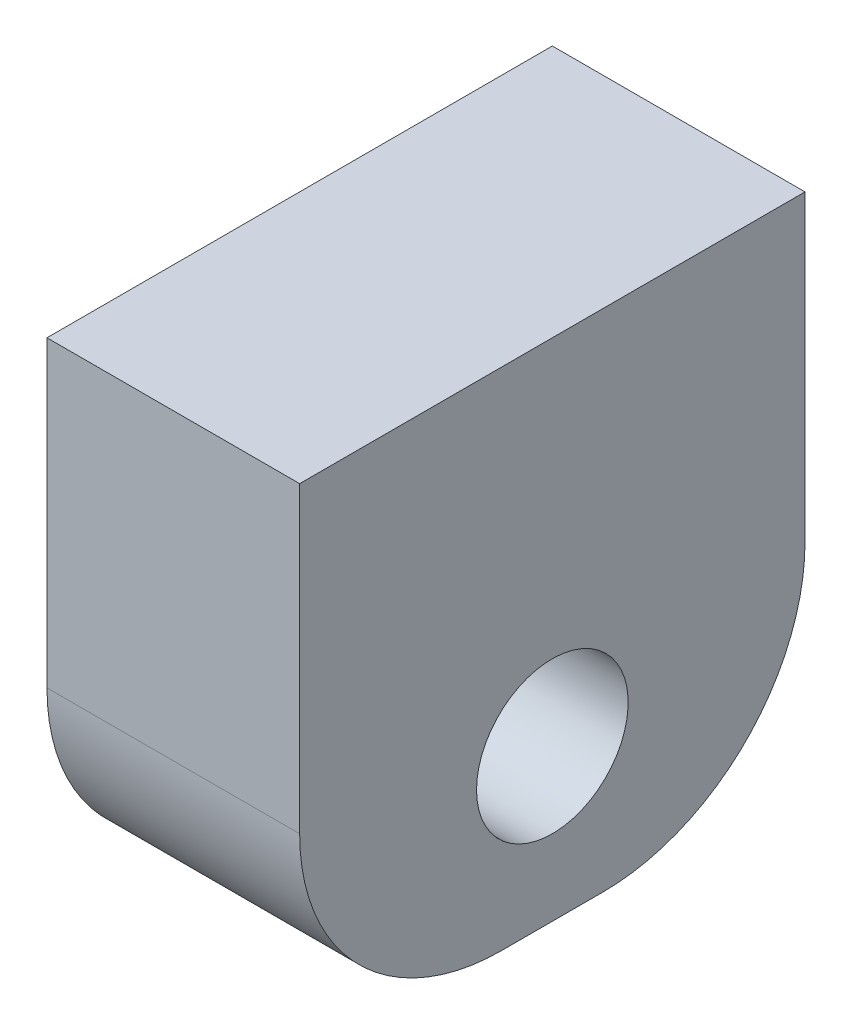
ISO-10303-21;
HEADER;
FILE_DESCRIPTION(('STEP AP214'),'2;1');
FILE_NAME('part.step','',(''),(''),'','','');
FILE_SCHEMA(('AUTOMOTIVE_DESIGN { 1 0 10303 214 1 1 1 1 }'));
ENDSEC;
DATA;
#1=APPLICATION_CONTEXT('core data for automotive mechanical design processes');
#2=APPLICATION_PROTOCOL_DEFINITION('international standard','automotive_design',2000,#1);
#3=PRODUCT_CONTEXT('',#1,'mechanical');
#4=PRODUCT('Part','Part','',(#3));
#5=PRODUCT_RELATED_PRODUCT_CATEGORY('part','',(#4));
#6=PRODUCT_DEFINITION_FORMATION('','',#4);
#7=PRODUCT_DEFINITION_CONTEXT('part definition',#1,'design');
#8=PRODUCT_DEFINITION('design','',#6,#7);
#9=PRODUCT_DEFINITION_SHAPE('','',#8);
#10=(LENGTH_UNIT() NAMED_UNIT(*) SI_UNIT(.MILLI.,.METRE.));
#11=(NAMED_UNIT(*) PLANE_ANGLE_UNIT() SI_UNIT($,.RADIAN.));
#12=(NAMED_UNIT(*) SI_UNIT($,.STERADIAN.) SOLID_ANGLE_UNIT());
#13=UNCERTAINTY_MEASURE_WITH_UNIT(LENGTH_MEASURE(1.E-05),#10,'distance_accuracy_value','');
#14=(GEOMETRIC_REPRESENTATION_CONTEXT(3) GLOBAL_UNCERTAINTY_ASSIGNED_CONTEXT((#13)) GLOBAL_UNIT_ASSIGNED_CONTEXT((#10,
#11,#12)) REPRESENTATION_CONTEXT('',''));
#15=CARTESIAN_POINT('',(0.,0.,0.));
#16=DIRECTION('',(0.,0.,1.));
#17=DIRECTION('',(1.,0.,0.));
#18=AXIS2_PLACEMENT_3D('',#15,#16,#17);
#19=CARTESIAN_POINT('',(0.,0.,10.));
#20=DIRECTION('',(1.,0.,0.));
#21=DIRECTION('',(0.,0.,-1.));
#22=AXIS2_PLACEMENT_3D('',#19,#20,#21);
#23=PLANE('',#22);
#24=CARTESIAN_POINT('',(0.,3.,5.));
#25=DIRECTION('',(-1.,0.,0.));
#26=DIRECTION('',(0.,0.,1.));
#27=AXIS2_PLACEMENT_3D('',#24,#25,#26);
#28=CIRCLE('',#27,1.5);
#29=CARTESIAN_POINT('',(0.,3.,6.5));
#30=VERTEX_POINT('',#29);
#31=EDGE_CURVE('E169',#30,#30,#28,.T.);
#32=ORIENTED_EDGE('',*,*,#31,.F.);
#33=EDGE_LOOP('',(#32));
#34=FACE_BOUND('',#33,.T.);
#35=DIRECTION('',(0.,-1.,0.));
#36=VECTOR('',#35,1.);
#37=CARTESIAN_POINT('',(0.,0.,0.));
#38=LINE('',#37,#36);
#39=CARTESIAN_POINT('',(0.,10.,0.));
#40=VERTEX_POINT('',#39);
#41=CARTESIAN_POINT('',(0.,4.,0.));
#42=VERTEX_POINT('',#41);
#43=EDGE_CURVE('E126',#40,#42,#38,.T.);
#44=ORIENTED_EDGE('',*,*,#43,.T.);
#45=CARTESIAN_POINT('',(0.,4.,4.));
#46=DIRECTION('',(1.,0.,0.));
#47=DIRECTION('',(0.,0.,-1.));
#48=AXIS2_PLACEMENT_3D('',#45,#46,#47);
#49=CIRCLE('',#48,4.);
#50=CARTESIAN_POINT('',(0.,0.,4.));
#51=VERTEX_POINT('',#50);
#52=EDGE_CURVE('E48',#42,#51,#49,.F.);
#53=ORIENTED_EDGE('',*,*,#52,.T.);
#54=DIRECTION('',(0.,0.,-1.));
#55=VECTOR('',#54,1.);
#56=CARTESIAN_POINT('',(0.,0.,10.));
#57=LINE('',#56,#55);
#58=CARTESIAN_POINT('',(0.,0.,6.));
#59=VERTEX_POINT('',#58);
#60=EDGE_CURVE('E137',#59,#51,#57,.T.);
#61=ORIENTED_EDGE('',*,*,#60,.F.);
#62=CARTESIAN_POINT('',(0.,4.,6.));
#63=DIRECTION('',(1.,0.,0.));
#64=DIRECTION('',(0.,0.,-1.));
#65=AXIS2_PLACEMENT_3D('',#62,#63,#64);
#66=CIRCLE('',#65,4.);
#67=CARTESIAN_POINT('',(0.,4.,10.));
#68=VERTEX_POINT('',#67);
#69=EDGE_CURVE('E55',#59,#68,#66,.F.);
#70=ORIENTED_EDGE('',*,*,#69,.T.);
#71=DIRECTION('',(0.,-1.,0.));
#72=VECTOR('',#71,1.);
#73=CARTESIAN_POINT('',(0.,0.,10.));
#74=LINE('',#73,#72);
#75=CARTESIAN_POINT('',(0.,10.,10.));
#76=VERTEX_POINT('',#75);
#77=EDGE_CURVE('E105',#76,#68,#74,.T.);
#78=ORIENTED_EDGE('',*,*,#77,.F.);
#79=DIRECTION('',(0.,0.,-1.));
#80=VECTOR('',#79,1.);
#81=CARTESIAN_POINT('',(0.,10.,10.));
#82=LINE('',#81,#80);
#83=EDGE_CURVE('E116',#76,#40,#82,.T.);
#84=ORIENTED_EDGE('',*,*,#83,.T.);
#85=EDGE_LOOP('',(#44,#53,#61,#70,#78,#84));
#86=FACE_BOUND('',#85,.T.);
#87=ADVANCED_FACE('F39',(#34,#86),#23,.F.);
#88=CARTESIAN_POINT('',(0.,0.,10.));
#89=DIRECTION('',(0.,1.,0.));
#90=DIRECTION('',(0.,0.,1.));
#91=AXIS2_PLACEMENT_3D('',#88,#89,#90);
#92=PLANE('',#91);
#93=ORIENTED_EDGE('',*,*,#60,.T.);
#94=DIRECTION('',(1.,0.,0.));
#95=VECTOR('',#94,1.);
#96=CARTESIAN_POINT('',(5.,0.,4.));
#97=LINE('',#96,#95);
#98=CARTESIAN_POINT('',(5.,0.,4.));
#99=VERTEX_POINT('',#98);
#100=EDGE_CURVE('E144',#51,#99,#97,.T.);
#101=ORIENTED_EDGE('',*,*,#100,.T.);
#102=DIRECTION('',(0.,0.,-1.));
#103=VECTOR('',#102,1.);
#104=CARTESIAN_POINT('',(5.,0.,10.));
#105=LINE('',#104,#103);
#106=CARTESIAN_POINT('',(5.,0.,6.));
#107=VERTEX_POINT('',#106);
#108=EDGE_CURVE('E115',#107,#99,#105,.T.);
#109=ORIENTED_EDGE('',*,*,#108,.F.);
#110=DIRECTION('',(1.,0.,0.));
#111=VECTOR('',#110,1.);
#112=CARTESIAN_POINT('',(0.,0.,6.));
#113=LINE('',#112,#111);
#114=EDGE_CURVE('E141',#107,#59,#113,.F.);
#115=ORIENTED_EDGE('',*,*,#114,.T.);
#116=EDGE_LOOP('',(#93,#101,#109,#115));
#117=FACE_BOUND('',#116,.T.);
#118=ADVANCED_FACE('F162',(#117),#92,.F.);
#119=CARTESIAN_POINT('',(5.,0.,10.));
#120=DIRECTION('',(-1.,0.,0.));
#121=DIRECTION('',(0.,0.,1.));
#122=AXIS2_PLACEMENT_3D('',#119,#120,#121);
#123=PLANE('',#122);
#124=CARTESIAN_POINT('',(5.,3.,5.));
#125=DIRECTION('',(-1.,0.,0.));
#126=DIRECTION('',(0.,0.,1.));
#127=AXIS2_PLACEMENT_3D('',#124,#125,#126);
#128=CIRCLE('',#127,1.5);
#129=CARTESIAN_POINT('',(5.,3.,6.5));
#130=VERTEX_POINT('',#129);
#131=EDGE_CURVE('E129',#130,#130,#128,.T.);
#132=ORIENTED_EDGE('',*,*,#131,.T.);
#133=EDGE_LOOP('',(#132));
#134=FACE_BOUND('',#133,.T.);
#135=ORIENTED_EDGE('',*,*,#108,.T.);
#136=CARTESIAN_POINT('',(5.,4.,4.));
#137=DIRECTION('',(-1.,0.,0.));
#138=DIRECTION('',(0.,0.,1.));
#139=AXIS2_PLACEMENT_3D('',#136,#137,#138);
#140=CIRCLE('',#139,4.);
#141=CARTESIAN_POINT('',(5.,4.,0.));
#142=VERTEX_POINT('',#141);
#143=EDGE_CURVE('E151',#99,#142,#140,.F.);
#144=ORIENTED_EDGE('',*,*,#143,.T.);
#145=DIRECTION('',(0.,1.,0.));
#146=VECTOR('',#145,1.);
#147=CARTESIAN_POINT('',(5.,0.,0.));
#148=LINE('',#147,#146);
#149=CARTESIAN_POINT('',(5.,10.,0.));
#150=VERTEX_POINT('',#149);
#151=EDGE_CURVE('E111',#142,#150,#148,.T.);
#152=ORIENTED_EDGE('',*,*,#151,.T.);
#153=DIRECTION('',(0.,0.,-1.));
#154=VECTOR('',#153,1.);
#155=CARTESIAN_POINT('',(5.,10.,10.));
#156=LINE('',#155,#154);
#157=CARTESIAN_POINT('',(5.,10.,10.));
#158=VERTEX_POINT('',#157);
#159=EDGE_CURVE('E108',#158,#150,#156,.T.);
#160=ORIENTED_EDGE('',*,*,#159,.F.);
#161=DIRECTION('',(0.,1.,0.));
#162=VECTOR('',#161,1.);
#163=CARTESIAN_POINT('',(5.,0.,10.));
#164=LINE('',#163,#162);
#165=CARTESIAN_POINT('',(5.,4.,10.));
#166=VERTEX_POINT('',#165);
#167=EDGE_CURVE('E96',#166,#158,#164,.T.);
#168=ORIENTED_EDGE('',*,*,#167,.F.);
#169=CARTESIAN_POINT('',(5.,4.,6.));
#170=DIRECTION('',(-1.,0.,0.));
#171=DIRECTION('',(0.,0.,1.));
#172=AXIS2_PLACEMENT_3D('',#169,#170,#171);
#173=CIRCLE('',#172,4.);
#174=EDGE_CURVE('E148',#166,#107,#173,.F.);
#175=ORIENTED_EDGE('',*,*,#174,.T.);
#176=EDGE_LOOP('',(#135,#144,#152,#160,#168,#175));
#177=FACE_BOUND('',#176,.T.);
#178=ADVANCED_FACE('F110',(#134,#177),#123,.F.);
#179=CARTESIAN_POINT('',(0.,10.,10.));
#180=DIRECTION('',(0.,-1.,0.));
#181=DIRECTION('',(0.,0.,-1.));
#182=AXIS2_PLACEMENT_3D('',#179,#180,#181);
#183=PLANE('',#182);
#184=DIRECTION('',(-1.,0.,0.));
#185=VECTOR('',#184,1.);
#186=CARTESIAN_POINT('',(0.,10.,0.));
#187=LINE('',#186,#185);
#188=EDGE_CURVE('E132',#150,#40,#187,.T.);
#189=ORIENTED_EDGE('',*,*,#188,.T.);
#190=ORIENTED_EDGE('',*,*,#83,.F.);
#191=DIRECTION('',(-1.,0.,0.));
#192=VECTOR('',#191,1.);
#193=CARTESIAN_POINT('',(0.,10.,10.));
#194=LINE('',#193,#192);
#195=EDGE_CURVE('E100',#158,#76,#194,.T.);
#196=ORIENTED_EDGE('',*,*,#195,.F.);
#197=ORIENTED_EDGE('',*,*,#159,.T.);
#198=EDGE_LOOP('',(#189,#190,#196,#197));
#199=FACE_BOUND('',#198,.T.);
#200=ADVANCED_FACE('F118',(#199),#183,.F.);
#201=CARTESIAN_POINT('',(0.,0.,10.));
#202=DIRECTION('',(0.,0.,-1.));
#203=DIRECTION('',(-1.,0.,0.));
#204=AXIS2_PLACEMENT_3D('',#201,#202,#203);
#205=PLANE('',#204);
#206=ORIENTED_EDGE('',*,*,#77,.T.);
#207=DIRECTION('',(1.,0.,0.));
#208=VECTOR('',#207,1.);
#209=CARTESIAN_POINT('',(0.,4.,10.));
#210=LINE('',#209,#208);
#211=EDGE_CURVE('E11',#68,#166,#210,.T.);
#212=ORIENTED_EDGE('',*,*,#211,.T.);
#213=ORIENTED_EDGE('',*,*,#167,.T.);
#214=ORIENTED_EDGE('',*,*,#195,.T.);
#215=EDGE_LOOP('',(#206,#212,#213,#214));
#216=FACE_BOUND('',#215,.T.);
#217=ADVANCED_FACE('F98',(#216),#205,.F.);
#218=CARTESIAN_POINT('',(0.,0.,0.));
#219=DIRECTION('',(0.,0.,-1.));
#220=DIRECTION('',(-1.,0.,0.));
#221=AXIS2_PLACEMENT_3D('',#218,#219,#220);
#222=PLANE('',#221);
#223=ORIENTED_EDGE('',*,*,#151,.F.);
#224=DIRECTION('',(1.,0.,0.));
#225=VECTOR('',#224,1.);
#226=CARTESIAN_POINT('',(0.,4.,0.));
#227=LINE('',#226,#225);
#228=EDGE_CURVE('E63',#142,#42,#227,.F.);
#229=ORIENTED_EDGE('',*,*,#228,.T.);
#230=ORIENTED_EDGE('',*,*,#43,.F.);
#231=ORIENTED_EDGE('',*,*,#188,.F.);
#232=EDGE_LOOP('',(#223,#229,#230,#231));
#233=FACE_BOUND('',#232,.T.);
#234=ADVANCED_FACE('F166',(#233),#222,.T.);
#235=CARTESIAN_POINT('',(5.,3.,5.));
#236=DIRECTION('',(-1.,0.,0.));
#237=DIRECTION('',(0.,0.,1.));
#238=AXIS2_PLACEMENT_3D('',#235,#236,#237);
#239=CYLINDRICAL_SURFACE('',#238,1.5);
#240=ORIENTED_EDGE('',*,*,#131,.F.);
#241=EDGE_LOOP('',(#240));
#242=FACE_BOUND('',#241,.T.);
#243=ORIENTED_EDGE('',*,*,#31,.T.);
#244=EDGE_LOOP('',(#243));
#245=FACE_BOUND('',#244,.T.);
#246=ADVANCED_FACE('F178',(#242,#245),#239,.F.);
#247=CARTESIAN_POINT('',(0.,4.,4.));
#248=DIRECTION('',(-1.,0.,0.));
#249=DIRECTION('',(0.,0.,1.));
#250=AXIS2_PLACEMENT_3D('',#247,#248,#249);
#251=CYLINDRICAL_SURFACE('',#250,4.);
#252=ORIENTED_EDGE('',*,*,#52,.F.);
#253=ORIENTED_EDGE('',*,*,#228,.F.);
#254=ORIENTED_EDGE('',*,*,#143,.F.);
#255=ORIENTED_EDGE('',*,*,#100,.F.);
#256=EDGE_LOOP('',(#252,#253,#254,#255));
#257=FACE_BOUND('',#256,.T.);
#258=ADVANCED_FACE('F165',(#257),#251,.T.);
#259=CARTESIAN_POINT('',(0.,4.,6.));
#260=DIRECTION('',(1.,0.,0.));
#261=DIRECTION('',(0.,0.,-1.));
#262=AXIS2_PLACEMENT_3D('',#259,#260,#261);
#263=CYLINDRICAL_SURFACE('',#262,4.);
#264=ORIENTED_EDGE('',*,*,#69,.F.);
#265=ORIENTED_EDGE('',*,*,#114,.F.);
#266=ORIENTED_EDGE('',*,*,#174,.F.);
#267=ORIENTED_EDGE('',*,*,#211,.F.);
#268=EDGE_LOOP('',(#264,#265,#266,#267));
#269=FACE_BOUND('',#268,.T.);
#270=ADVANCED_FACE('F41',(#269),#263,.T.);
#271=CLOSED_SHELL('',(#87,#118,#178,#200,#217,#234,#246,#258,#270));
#272=MANIFOLD_SOLID_BREP('B2',#271);
#273=ADVANCED_BREP_SHAPE_REPRESENTATION('',(#18,#272),#14);
#274=SHAPE_DEFINITION_REPRESENTATION(#9,#273);
ENDSEC;
END-ISO-10303-21;
